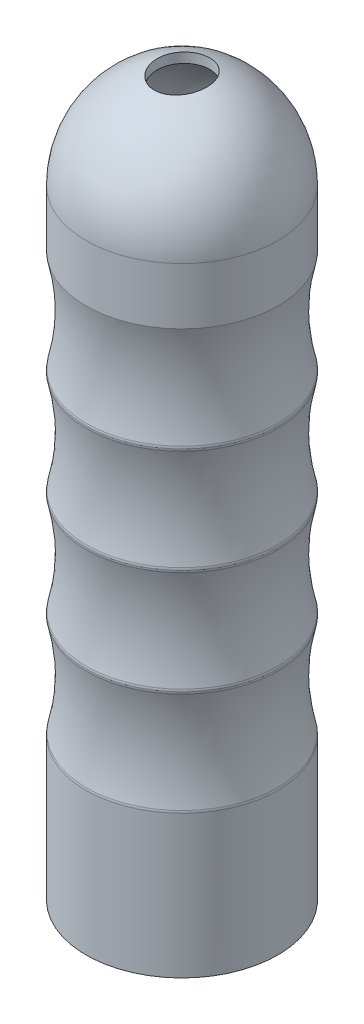
ISO-10303-21;
HEADER;
FILE_DESCRIPTION(('STEP AP214'),'2;1');
FILE_NAME('part.step','',(''),(''),'','','');
FILE_SCHEMA(('AUTOMOTIVE_DESIGN { 1 0 10303 214 1 1 1 1 }'));
ENDSEC;
DATA;
#1=APPLICATION_CONTEXT('core data for automotive mechanical design processes');
#2=APPLICATION_PROTOCOL_DEFINITION('international standard','automotive_design',2000,#1);
#3=PRODUCT_CONTEXT('',#1,'mechanical');
#4=PRODUCT('Part','Part','',(#3));
#5=PRODUCT_RELATED_PRODUCT_CATEGORY('part','',(#4));
#6=PRODUCT_DEFINITION_FORMATION('','',#4);
#7=PRODUCT_DEFINITION_CONTEXT('part definition',#1,'design');
#8=PRODUCT_DEFINITION('design','',#6,#7);
#9=PRODUCT_DEFINITION_SHAPE('','',#8);
#10=(LENGTH_UNIT() NAMED_UNIT(*) SI_UNIT(.MILLI.,.METRE.));
#11=(NAMED_UNIT(*) PLANE_ANGLE_UNIT() SI_UNIT($,.RADIAN.));
#12=(NAMED_UNIT(*) SI_UNIT($,.STERADIAN.) SOLID_ANGLE_UNIT());
#13=UNCERTAINTY_MEASURE_WITH_UNIT(LENGTH_MEASURE(1.E-05),#10,'distance_accuracy_value','');
#14=(GEOMETRIC_REPRESENTATION_CONTEXT(3) GLOBAL_UNCERTAINTY_ASSIGNED_CONTEXT((#13)) GLOBAL_UNIT_ASSIGNED_CONTEXT((#10,
#11,#12)) REPRESENTATION_CONTEXT('',''));
#15=CARTESIAN_POINT('',(0.,0.,0.));
#16=DIRECTION('',(0.,0.,1.));
#17=DIRECTION('',(1.,0.,0.));
#18=AXIS2_PLACEMENT_3D('',#15,#16,#17);
#19=CARTESIAN_POINT('',(0.,100.,0.));
#20=DIRECTION('',(0.,-1.,0.));
#21=DIRECTION('',(0.,0.,-1.));
#22=AXIS2_PLACEMENT_3D('',#19,#20,#21);
#23=DEGENERATE_TOROIDAL_SURFACE('',#22,1.03571428571432,16.5357142857143,.F.);
#24=CARTESIAN_POINT('',(0.,100.,0.));
#25=DIRECTION('',(0.,-1.,0.));
#26=DIRECTION('',(0.,0.,-1.));
#27=AXIS2_PLACEMENT_3D('',#24,#25,#26);
#28=CIRCLE('',#27,15.5);
#29=CARTESIAN_POINT('',(0.,100.,-15.5));
#30=VERTEX_POINT('',#29);
#31=EDGE_CURVE('E338',#30,#30,#28,.T.);
#32=ORIENTED_EDGE('',*,*,#31,.F.);
#33=EDGE_LOOP('',(#32));
#34=FACE_BOUND('',#33,.T.);
#35=CARTESIAN_POINT('',(0.,115.581582534701,-4.5));
#36=CARTESIAN_POINT('',(-0.0981692995057858,115.581582639021,-4.49999927074386));
#37=CARTESIAN_POINT('',(-0.196355590355747,115.581886487817,-4.49592922326536));
#38=CARTESIAN_POINT('',(-0.392087741586017,115.583094006383,-4.47969095949098));
#39=CARTESIAN_POINT('',(-0.489633277316327,115.583997959603,-4.46751891632919));
#40=CARTESIAN_POINT('',(-0.683575616075892,115.586384012318,-4.43517559616213));
#41=CARTESIAN_POINT('',(-0.779969931082185,115.587867189324,-4.41498940953482));
#42=CARTESIAN_POINT('',(-0.970799102324878,115.591371342624,-4.36684503018828));
#43=CARTESIAN_POINT('',(-1.06523323039939,115.593392515048,-4.33888400292785));
#44=CARTESIAN_POINT('',(-1.3489333838932,115.600291820635,-4.24229694021195));
#45=CARTESIAN_POINT('',(-1.53423719101143,115.60594914513,-4.16169921710396));
#46=CARTESIAN_POINT('',(-1.88943902964207,115.618721013184,-3.97248187186528));
#47=CARTESIAN_POINT('',(-2.05935684687812,115.625833645756,-3.86389894944936));
#48=CARTESIAN_POINT('',(-2.30463103741444,115.637286578682,-3.67980585583818));
#49=CARTESIAN_POINT('',(-2.38666530897151,115.64134485107,-3.61298131167068));
#50=CARTESIAN_POINT('',(-2.54532693574494,115.649581462553,-3.47321968521007));
#51=CARTESIAN_POINT('',(-2.62195481811878,115.653759789888,-3.40028320039162));
#52=CARTESIAN_POINT('',(-2.84472293385951,115.666412237084,-3.17165758359934));
#53=CARTESIAN_POINT('',(-2.98215920977308,115.674926635766,-3.00735482070537));
#54=CARTESIAN_POINT('',(-3.23204871844149,115.691314233588,-2.66063811629832));
#55=CARTESIAN_POINT('',(-3.34448219807091,115.699186922666,-2.4782100185554));
#56=CARTESIAN_POINT('',(-3.50103625229872,115.710589505233,-2.18012199440756));
#57=CARTESIAN_POINT('',(-3.5539013881414,115.714544796162,-2.06897219072291));
#58=CARTESIAN_POINT('',(-3.65084685065127,115.721937628216,-1.8429882945287));
#59=CARTESIAN_POINT('',(-3.69493482135134,115.725375619214,-1.72815750988909));
#60=CARTESIAN_POINT('',(-3.77428461627472,115.731654482448,-1.49546535595576));
#61=CARTESIAN_POINT('',(-3.80954589659672,115.734495317885,-1.37760380039893));
#62=CARTESIAN_POINT('',(-3.87118723358227,115.739515395965,-1.13956668947431));
#63=CARTESIAN_POINT('',(-3.89756535641247,115.74169449454,-1.01939063626022));
#64=CARTESIAN_POINT('',(-3.96327390416609,115.747156747373,-0.65650861115802));
#65=CARTESIAN_POINT('',(-3.9892525801111,115.749370914344,-0.411229662861117));
#66=CARTESIAN_POINT('',(-4.0053403483565,115.750736932278,0.0803880214183862));
#67=CARTESIAN_POINT('',(-3.99545064655767,115.749888886196,0.326726721493843));
#68=CARTESIAN_POINT('',(-3.93987325575734,115.745208236019,0.815375229785288));
#69=CARTESIAN_POINT('',(-3.89418368521851,115.741375475058,1.05768482555966));
#70=CARTESIAN_POINT('',(-3.76726472288431,115.731066834872,1.5327991795074));
#71=CARTESIAN_POINT('',(-3.68603028276513,115.724590580211,1.76560258240983));
#72=CARTESIAN_POINT('',(-3.48848375854376,115.7095911775,2.2160628331973));
#73=CARTESIAN_POINT('',(-3.37216329182448,115.701067540398,2.43371604614638));
#74=CARTESIAN_POINT('',(-3.17308828333652,115.687448375878,2.742833224739));
#75=CARTESIAN_POINT('',(-3.10295371002364,115.682789600346,2.84262038126001));
#76=CARTESIAN_POINT('',(-2.95465109458715,115.673311752821,3.03602123947158));
#77=CARTESIAN_POINT('',(-2.8764858269858,115.668492736576,3.12963705506889));
#78=CARTESIAN_POINT('',(-2.71722896589628,115.659112415068,3.30457607872355));
#79=CARTESIAN_POINT('',(-2.63657453552406,115.654552486888,3.38629785639377));
#80=CARTESIAN_POINT('',(-2.46866358717294,115.645526763144,3.54287512043677));
#81=CARTESIAN_POINT('',(-2.38139973247379,115.641061079436,3.61772276622952));
#82=CARTESIAN_POINT('',(-2.20437809975596,115.632528245951,3.75687841101569));
#83=CARTESIAN_POINT('',(-2.11485713785364,115.628452311434,3.82148699979542));
#84=CARTESIAN_POINT('',(-1.93068265831056,115.620620516647,3.94293730718286));
#85=CARTESIAN_POINT('',(-1.83602964063029,115.616864625289,3.99977978046667));
#86=CARTESIAN_POINT('',(-1.64217495800874,115.609782092918,4.10506976553516));
#87=CARTESIAN_POINT('',(-1.54297451658104,115.606455337351,4.15351951886356));
#88=CARTESIAN_POINT('',(-1.34071301479137,115.600332413337,4.24144925372566));
#89=CARTESIAN_POINT('',(-1.23765401555118,115.597535966325,4.28093394667962));
#90=CARTESIAN_POINT('',(-1.03212402133939,115.592648888613,4.34922569284019));
#91=CARTESIAN_POINT('',(-0.929763539630643,115.590536612557,4.37836379749168));
#92=CARTESIAN_POINT('',(-0.7229699950416,115.586951891375,4.42748140470956));
#93=CARTESIAN_POINT('',(-0.61853935359076,115.58547874009,4.44747101664569));
#94=CARTESIAN_POINT('',(-0.41606571162259,115.583298306269,4.47695290113798));
#95=CARTESIAN_POINT('',(-0.318119630406357,115.58254255329,4.48711063026521));
#96=CARTESIAN_POINT('',(-0.121618389467321,115.581636316339,4.49928278998818));
#97=CARTESIAN_POINT('',(-0.0230627157088372,115.581486442663,4.5012890096696));
#98=CARTESIAN_POINT('',(0.175194482304086,115.581799956238,4.49708364806648));
#99=CARTESIAN_POINT('',(0.274893655773924,115.582271591614,4.49076154087941));
#100=CARTESIAN_POINT('',(0.473448145929714,115.583829608846,4.46977585629462));
#101=CARTESIAN_POINT('',(0.572303071371038,115.584916261524,4.45510860409503));
#102=CARTESIAN_POINT('',(0.768437034805128,115.587674259279,4.41759857630489));
#103=CARTESIAN_POINT('',(0.865716105224745,115.589345592307,4.39475596916507));
#104=CARTESIAN_POINT('',(1.05805634189069,115.593227384229,4.3411497020133));
#105=CARTESIAN_POINT('',(1.15311739246463,115.595437871172,4.31038562989002));
#106=CARTESIAN_POINT('',(1.34026120345854,115.60033534057,4.24132118151143));
#107=CARTESIAN_POINT('',(1.43234887768276,115.603021483686,4.20303406755175));
#108=CARTESIAN_POINT('',(1.61306270168959,115.608799829481,4.11934064225222));
#109=CARTESIAN_POINT('',(1.70169263793331,115.611891570831,4.07394240794023));
#110=CARTESIAN_POINT('',(1.96187766840176,115.621669569992,3.9276135211775));
#111=CARTESIAN_POINT('',(2.12782118502556,115.628861160116,3.81651385677514));
#112=CARTESIAN_POINT('',(2.44286332386139,115.64400131013,3.56993562691236));
#113=CARTESIAN_POINT('',(2.59177955220546,115.651956639785,3.4342272988029));
#114=CARTESIAN_POINT('',(2.86894990945702,115.66790312895,3.14297662305691));
#115=CARTESIAN_POINT('',(2.99719182147148,115.675894306798,2.9874226447437));
#116=CARTESIAN_POINT('',(3.18262955751401,115.688084900251,2.72861874675043));
#117=CARTESIAN_POINT('',(3.24718146951888,115.692478282742,2.63054297613498));
#118=CARTESIAN_POINT('',(3.36849358548229,115.700957988716,2.42981201657817));
#119=CARTESIAN_POINT('',(3.42526139972215,115.705044610316,2.32716143232311));
#120=CARTESIAN_POINT('',(3.58375217133794,115.716703236725,2.01322726020517));
#121=CARTESIAN_POINT('',(3.6737333203222,115.723678846788,1.7958613920997));
#122=CARTESIAN_POINT('',(3.82219882892735,115.735468908553,1.34830874892099));
#123=CARTESIAN_POINT('',(3.88035656166295,115.740260867248,1.11801482573326));
#124=CARTESIAN_POINT('',(3.96352200157854,115.747180756579,0.651338400924673));
#125=CARTESIAN_POINT('',(3.9885202276262,115.749307925275,0.414954177621061));
#126=CARTESIAN_POINT('',(4.00172093609785,115.750430107941,0.0403149811168532));
#127=CARTESIAN_POINT('',(4.00093756465416,115.750362807181,-0.0976477872137998));
#128=CARTESIAN_POINT('',(3.98811774160789,115.749275246901,-0.372967207473886));
#129=CARTESIAN_POINT('',(3.97608973651351,115.748255702668,-0.510324236608462));
#130=CARTESIAN_POINT('',(3.94085042150531,115.745295041372,-0.783209868959912));
#131=CARTESIAN_POINT('',(3.91766969175127,115.743356444514,-0.918742436243757));
#132=CARTESIAN_POINT('',(3.86019117098585,115.738615260566,-1.18740671841837));
#133=CARTESIAN_POINT('',(3.82589154521083,115.735812530888,-1.32053803324095));
#134=CARTESIAN_POINT('',(3.70909873415271,115.726437168015,-1.70591629216871));
#135=CARTESIAN_POINT('',(3.61145743982515,115.718783174658,-1.95374482972922));
#136=CARTESIAN_POINT('',(3.38127065113269,115.701774015461,-2.41813433500755));
#137=CARTESIAN_POINT('',(3.25059425190284,115.692516421403,-2.63561973678282));
#138=CARTESIAN_POINT('',(3.0325443734886,115.678237778062,-2.93709275470413));
#139=CARTESIAN_POINT('',(2.95864190828179,115.673555115144,-3.03103268696996));
#140=CARTESIAN_POINT('',(2.80331634934688,115.664119459507,-3.21244741381955));
#141=CARTESIAN_POINT('',(2.72189658993059,115.659366498746,-3.29992504407124));
#142=CARTESIAN_POINT('',(2.55664272431151,115.650187615707,-3.4629123256547));
#143=CARTESIAN_POINT('',(2.47319870237599,115.645758276526,-3.53881776882781));
#144=CARTESIAN_POINT('',(2.30031900933436,115.637074548836,-3.6834306491156));
#145=CARTESIAN_POINT('',(2.21088556242406,115.632820096319,-3.75214073421908));
#146=CARTESIAN_POINT('',(2.03127877629518,115.624818243305,-3.87831834043202));
#147=CARTESIAN_POINT('',(1.94138649062523,115.621055975339,-3.93618498866321));
#148=CARTESIAN_POINT('',(1.75698797558048,115.613890442016,-4.04434222193112));
#149=CARTESIAN_POINT('',(1.66247643049366,115.610487605223,-4.0946237929045));
#150=CARTESIAN_POINT('',(1.47218360200121,115.604229387557,-4.18570597310132));
#151=CARTESIAN_POINT('',(1.3765100410159,115.601361451304,-4.22673065827977));
#152=CARTESIAN_POINT('',(1.18203654786861,115.596139373942,-4.30057931796065));
#153=CARTESIAN_POINT('',(1.08323684989915,115.593785194451,-4.33340390513702));
#154=CARTESIAN_POINT('',(0.883256554560465,115.589659570098,-4.39045454389202));
#155=CARTESIAN_POINT('',(0.782077879293093,115.58788767102,-4.41468729884609));
#156=CARTESIAN_POINT('',(0.578040645139686,115.584977316343,-4.45428625921889));
#157=CARTESIAN_POINT('',(0.475183152983456,115.583838473479,-4.46965788554037));
#158=CARTESIAN_POINT('',(0.310107768491811,115.582550835813,-4.4869993980547));
#159=CARTESIAN_POINT('',(0.24818276023607,115.582188069459,-4.49187286080678));
#160=CARTESIAN_POINT('',(0.124174076403584,115.581703911178,-4.49837305256279));
#161=CARTESIAN_POINT('',(0.0620904367684074,115.581582468721,-4.50000046124228));
#162=CARTESIAN_POINT('',(0.,115.581582534701,-4.5));
#163=B_SPLINE_CURVE_WITH_KNOTS('',3,(#35,#36,#37,#38,#39,#40,#41,#42,#43,#44,#45,#46,#47,#48,
#49,#50,#51,#52,#53,#54,#55,#56,#57,#58,#59,#60,#61,#62,#63,#64,#65,#66,#67,#68,#69,#70,#71,#72,
#73,#74,#75,#76,#77,#78,#79,#80,#81,#82,#83,#84,#85,#86,#87,#88,#89,#90,#91,#92,#93,#94,#95,#96,
#97,#98,#99,#100,#101,#102,#103,#104,#105,#106,#107,#108,#109,#110,#111,#112,#113,#114,#115,
#116,#117,#118,#119,#120,#121,#122,#123,#124,#125,#126,#127,#128,#129,#130,#131,#132,#133,#134,
#135,#136,#137,#138,#139,#140,#141,#142,#143,#144,#145,#146,#147,#148,#149,#150,#151,#152,#153,
#154,#155,#156,#157,#158,#159,#160,#161,#162),.UNSPECIFIED.,.T.,.F.,(4,2,2,2,2,2,2,2,2,2,2,2,2,
2,2,2,2,2,2,2,2,2,2,2,2,2,2,2,2,2,2,2,2,2,2,2,2,2,2,2,2,2,2,2,2,2,2,2,2,2,2,2,2,2,2,2,2,2,2,2,2,
2,2,4),(0.,0.294452293259588,0.589043765785834,0.884185888031771,1.17943575420838,
1.78304057243121,2.38585781728426,2.70323211614143,3.02057542608706,3.66118034665213,
4.30228958463133,4.67139628717186,5.04018011477927,5.40898666128245,5.77787344390094,
6.51495969349684,7.25202116236082,7.98912137163735,8.72632630288989,9.46370750397552,
9.82953728145861,10.1952410908481,10.5395975563153,10.8843420369144,11.2153902247125,
11.5464062198238,11.8773336697808,12.2080868023635,12.5270243637852,12.8456086332076,
13.1406972055452,13.436082943362,13.7354285332211,14.0349060426638,14.334377381818,
14.6338643040088,14.9328279253764,15.2314544046814,15.8284120524039,16.4312607540559,
17.0344643962956,17.3866329833453,17.7384547726121,18.4417345099428,19.1521032349873,
19.8626750284681,20.2761690115077,20.6893526441543,21.1014097512634,21.5135348878401,
22.309098825283,23.0670384536611,23.425551706468,23.7839066969842,24.1222078411131,
24.4603840450714,24.7809498062098,25.1018935745585,25.4139455773219,25.7259742580042,
26.0377589543951,26.3493527097487,26.5356278580086,26.7218639989202),.UNSPECIFIED.);
#164=CARTESIAN_POINT('',(0.,115.581582534701,-4.5));
#165=VERTEX_POINT('',#164);
#166=EDGE_CURVE('E95',#165,#165,#163,.T.);
#167=ORIENTED_EDGE('',*,*,#166,.F.);
#168=EDGE_LOOP('',(#167));
#169=FACE_BOUND('',#168,.T.);
#170=ADVANCED_FACE('F34',(#34,#169),#23,.F.);
#171=CARTESIAN_POINT('',(0.,100.,0.));
#172=DIRECTION('',(0.,-1.,0.));
#173=DIRECTION('',(0.,0.,-1.));
#174=AXIS2_PLACEMENT_3D('',#171,#172,#173);
#175=DEGENERATE_TOROIDAL_SURFACE('',#174,1.03571428571432,15.0357142857143,.F.);
#176=CARTESIAN_POINT('',(0.,100.,0.));
#177=DIRECTION('',(0.,-1.,0.));
#178=DIRECTION('',(0.,0.,-1.));
#179=AXIS2_PLACEMENT_3D('',#176,#177,#178);
#180=CIRCLE('',#179,14.);
#181=CARTESIAN_POINT('',(0.,100.,-14.));
#182=VERTEX_POINT('',#181);
#183=EDGE_CURVE('E343',#182,#182,#180,.T.);
#184=ORIENTED_EDGE('',*,*,#183,.T.);
#185=EDGE_LOOP('',(#184));
#186=FACE_BOUND('',#185,.T.);
#187=CARTESIAN_POINT('',(0.,113.979576940257,-4.49999999999997));
#188=CARTESIAN_POINT('',(0.0976351991939196,113.979576163048,-4.50000464423259));
#189=CARTESIAN_POINT('',(0.195233332629258,113.979911592816,-4.49597740803208));
#190=CARTESIAN_POINT('',(0.389764654123515,113.981242113155,-4.47992780931387));
#191=CARTESIAN_POINT('',(0.486697959612835,113.98223708403,-4.4679068975097));
#192=CARTESIAN_POINT('',(0.680430220440437,113.984877324166,-4.4357992043573));
#193=CARTESIAN_POINT('',(0.777212995988072,113.986530407267,-4.41561545733166));
#194=CARTESIAN_POINT('',(0.968807014329091,113.990440704286,-4.36741554080934));
#195=CARTESIAN_POINT('',(1.063617547833,113.992698131633,-4.33939660408304));
#196=CARTESIAN_POINT('',(1.34445434623753,114.000300530204,-4.24389586843468));
#197=CARTESIAN_POINT('',(1.52670540832675,114.006472998396,-4.16500057038771));
#198=CARTESIAN_POINT('',(1.88384729394208,114.02069273982,-3.97616058616751));
#199=CARTESIAN_POINT('',(2.05811738305479,114.028807271845,-3.86506170064872));
#200=CARTESIAN_POINT('',(2.38727751494388,114.045946823452,-3.61753854331314));
#201=CARTESIAN_POINT('',(2.54218912262715,114.054970809301,-3.48114288015398));
#202=CARTESIAN_POINT('',(2.7638361539744,114.068935380439,-3.25516264299606));
#203=CARTESIAN_POINT('',(2.83829955943122,114.073840683537,-3.17298404405439));
#204=CARTESIAN_POINT('',(2.98070868026211,114.083566648995,-3.00316791285982));
#205=CARTESIAN_POINT('',(3.04865490679278,114.088387317968,-2.91553080962006));
#206=CARTESIAN_POINT('',(3.24364731033528,114.102646892404,-2.64359578050081));
#207=CARTESIAN_POINT('',(3.36039127520336,114.111787999755,-2.4517708836334));
#208=CARTESIAN_POINT('',(3.56523070742686,114.128475855185,-2.05325508973514));
#209=CARTESIAN_POINT('',(3.65330512941245,114.136021430618,-1.84655340744513));
#210=CARTESIAN_POINT('',(3.76895690027668,114.146178185625,-1.5129116297235));
#211=CARTESIAN_POINT('',(3.80635281602666,114.14952518791,-1.38930268874936));
#212=CARTESIAN_POINT('',(3.87133201927111,114.155406473304,-1.13961012960045));
#213=CARTESIAN_POINT('',(3.89892375111167,114.157941455619,-1.01352874020745));
#214=CARTESIAN_POINT('',(3.9442852391106,114.1621379904,-0.759577166328964));
#215=CARTESIAN_POINT('',(3.96205346049826,114.163799406383,-0.631706705526789));
#216=CARTESIAN_POINT('',(3.98774425184293,114.166209888955,-0.374974284869603));
#217=CARTESIAN_POINT('',(3.99566471015139,114.166958759867,-0.246112118322276));
#218=CARTESIAN_POINT('',(4.0046031912034,114.167799315009,0.140761227155291));
#219=CARTESIAN_POINT('',(3.99083845351762,114.166488744287,0.399285876743659));
#220=CARTESIAN_POINT('',(3.9239205513343,114.160241145117,0.911032443995296));
#221=CARTESIAN_POINT('',(3.87076460520842,114.155303860567,1.16425398587863));
#222=CARTESIAN_POINT('',(3.72530421060488,114.142280625878,1.65941500129486));
#223=CARTESIAN_POINT('',(3.63299275119772,114.13419411188,1.90135244575609));
#224=CARTESIAN_POINT('',(3.46677726307347,114.120419973438,2.24856377817294));
#225=CARTESIAN_POINT('',(3.40726167351655,114.115594159,2.36094723705607));
#226=CARTESIAN_POINT('',(3.27912944551143,114.105520839233,2.58037419424578));
#227=CARTESIAN_POINT('',(3.21051606772451,114.100273485248,2.68741958689699));
#228=CARTESIAN_POINT('',(3.06849174238989,114.08980505958,2.88946121659844));
#229=CARTESIAN_POINT('',(2.99556128654106,114.08459882155,2.98479648819088));
#230=CARTESIAN_POINT('',(2.84195512880453,114.074074544309,3.16921080745128));
#231=CARTESIAN_POINT('',(2.76127040499274,114.06875638063,3.25828235365227));
#232=CARTESIAN_POINT('',(2.5961538755494,114.058389351048,3.4255838074553));
#233=CARTESIAN_POINT('',(2.51202575697155,114.053338623569,3.50411319637616));
#234=CARTESIAN_POINT('',(2.33744691577435,114.043417268995,3.65380614880876));
#235=CARTESIAN_POINT('',(2.24699686467839,114.038546622856,3.72497049265852));
#236=CARTESIAN_POINT('',(2.06028702988195,114.029128353197,3.85917388657513));
#237=CARTESIAN_POINT('',(1.96402955420831,114.024580602895,3.92221613375362));
#238=CARTESIAN_POINT('',(1.76631262186168,114.015948014821,4.03945800678426));
#239=CARTESIAN_POINT('',(1.66485604806189,114.011862924455,4.09366246488482));
#240=CARTESIAN_POINT('',(1.46146608371462,114.004433615933,4.19065675563516));
#241=CARTESIAN_POINT('',(1.35970719878199,114.001066637282,4.23381067420654));
#242=CARTESIAN_POINT('',(1.15279943692106,113.994987445286,4.31080764674879));
#243=CARTESIAN_POINT('',(1.04765367663551,113.992274648425,4.34465900218972));
#244=CARTESIAN_POINT('',(0.845430766875002,113.987824197914,4.39973611107274));
#245=CARTESIAN_POINT('',(0.748606984134707,113.986015868006,4.42188983653005));
#246=CARTESIAN_POINT('',(0.553433463594797,113.983045449655,4.45810870694141));
#247=CARTESIAN_POINT('',(0.455083581166409,113.98188342285,4.47217308039827));
#248=CARTESIAN_POINT('',(0.258536351333467,113.980246369352,4.49194859370472));
#249=CARTESIAN_POINT('',(0.160347323177148,113.979764585345,4.4977419021931));
#250=CARTESIAN_POINT('',(-0.0361738869038886,113.979479397111,4.5011738810901));
#251=CARTESIAN_POINT('',(-0.13450606763982,113.979675987282,4.49881261883513));
#252=CARTESIAN_POINT('',(-0.330634910861735,113.98074219249,4.48596196226105));
#253=CARTESIAN_POINT('',(-0.428431566433407,113.981611816197,4.47547246324408));
#254=CARTESIAN_POINT('',(-0.622809671749595,113.98400015961,4.44648626278204));
#255=CARTESIAN_POINT('',(-0.719391241495384,113.985518814691,4.42799035853593));
#256=CARTESIAN_POINT('',(-0.910683111401306,113.989164229315,4.3831987871292));
#257=CARTESIAN_POINT('',(-1.00539407349856,113.991290769473,4.35690593373669));
#258=CARTESIAN_POINT('',(-1.19240481724487,113.996096108318,4.29679999577828));
#259=CARTESIAN_POINT('',(-1.28470349464864,113.998775155099,4.26298353232718));
#260=CARTESIAN_POINT('',(-1.55904492005188,114.007604687242,4.14993698415457));
#261=CARTESIAN_POINT('',(-1.73660463734991,114.014508872206,4.05956632409844));
#262=CARTESIAN_POINT('',(-2.07592692790213,114.029648001123,3.85267980264971));
#263=CARTESIAN_POINT('',(-2.23766053884939,114.037885314271,3.73611724785978));
#264=CARTESIAN_POINT('',(-2.55680378301979,114.055761026234,3.46857741559106));
#265=CARTESIAN_POINT('',(-2.71235236909875,114.065458229769,3.31538601051278));
#266=CARTESIAN_POINT('',(-2.99835342745956,114.084622197127,2.98740972919399));
#267=CARTESIAN_POINT('',(-3.12882651988958,114.094089144649,2.81264279094));
#268=CARTESIAN_POINT('',(-3.3102528150074,114.107931706264,2.52920548017149));
#269=CARTESIAN_POINT('',(-3.37049390230417,114.112674564273,2.42636248778911));
#270=CARTESIAN_POINT('',(-3.48286973834733,114.121733355561,2.21641407897016));
#271=CARTESIAN_POINT('',(-3.53500989134452,114.126049572753,2.10931156454926));
#272=CARTESIAN_POINT('',(-3.67912429341428,114.138204761946,1.78258513430417));
#273=CARTESIAN_POINT('',(-3.7588764536721,114.145256928747,1.55740988835009));
#274=CARTESIAN_POINT('',(-3.88498394471315,114.156620059313,1.09801867208372));
#275=CARTESIAN_POINT('',(-3.93134458894082,114.16093145919,0.863804146404147));
#276=CARTESIAN_POINT('',(-3.99050022124912,114.166460417446,0.391150778965715));
#277=CARTESIAN_POINT('',(-4.00329785902562,114.167678220054,0.152712272173478));
#278=CARTESIAN_POINT('',(-3.99526012313022,114.166919503423,-0.323587166505279));
#279=CARTESIAN_POINT('',(-3.97442486690789,114.164942995338,-0.561448100405839));
#280=CARTESIAN_POINT('',(-3.8992207259332,114.157957900516,-1.03180972207236));
#281=CARTESIAN_POINT('',(-3.84484943552675,114.152949096261,-1.26431002406063));
#282=CARTESIAN_POINT('',(-3.70286779916998,114.140320629388,-1.7189482832106));
#283=CARTESIAN_POINT('',(-3.61525242355111,114.132700571716,-1.94108466664812));
#284=CARTESIAN_POINT('',(-3.40740914849956,114.115525859975,-2.36962180714392));
#285=CARTESIAN_POINT('',(-3.2871734818436,114.105970745286,-2.57601880147952));
#286=CARTESIAN_POINT('',(-3.01535401889662,114.0858459631,-2.96717792440934));
#287=CARTESIAN_POINT('',(-2.86375985434125,114.075275960666,-3.15193286562474));
#288=CARTESIAN_POINT('',(-2.53918605493774,114.054741730677,-3.4854046473227));
#289=CARTESIAN_POINT('',(-2.36753922645508,114.044772303039,-3.63540338098393));
#290=CARTESIAN_POINT('',(-2.09781524294311,114.030969219204,-3.83325179917363));
#291=CARTESIAN_POINT('',(-2.00853930390519,114.026666786446,-3.89332651363007));
#292=CARTESIAN_POINT('',(-1.82529968445018,114.018443659261,-4.00587831999196));
#293=CARTESIAN_POINT('',(-1.73133722746512,114.014522865986,-4.05835738095542));
#294=CARTESIAN_POINT('',(-1.54349618697436,114.007334792244,-4.15302427419525));
#295=CARTESIAN_POINT('',(-1.44979518932555,114.004046371847,-4.19556288021234));
#296=CARTESIAN_POINT('',(-1.25911595200204,113.998004525258,-4.27276583285241));
#297=CARTESIAN_POINT('',(-1.16213522811181,113.995251515771,-4.30742404977209));
#298=CARTESIAN_POINT('',(-0.891956498497495,113.988532003865,-4.39126940537899));
#299=CARTESIAN_POINT('',(-0.716010372654242,113.985198183553,-4.431932060026));
#300=CARTESIAN_POINT('',(-0.35999996380376,113.980721723219,-4.48628870491608));
#301=CARTESIAN_POINT('',(-0.179937035460047,113.979578372617,-4.4999914408998));
#302=CARTESIAN_POINT('',(0.,113.979576940257,-4.49999999999997));
#303=B_SPLINE_CURVE_WITH_KNOTS('',3,(#187,#188,#189,#190,#191,#192,#193,#194,#195,#196,#197,
#198,#199,#200,#201,#202,#203,#204,#205,#206,#207,#208,#209,#210,#211,#212,#213,#214,#215,#216,
#217,#218,#219,#220,#221,#222,#223,#224,#225,#226,#227,#228,#229,#230,#231,#232,#233,#234,#235,
#236,#237,#238,#239,#240,#241,#242,#243,#244,#245,#246,#247,#248,#249,#250,#251,#252,#253,#254,
#255,#256,#257,#258,#259,#260,#261,#262,#263,#264,#265,#266,#267,#268,#269,#270,#271,#272,#273,
#274,#275,#276,#277,#278,#279,#280,#281,#282,#283,#284,#285,#286,#287,#288,#289,#290,#291,#292,
#293,#294,#295,#296,#297,#298,#299,#300,#301,#302),.UNSPECIFIED.,.T.,.F.,(4,2,2,2,2,2,2,2,2,2,2,
2,2,2,2,2,2,2,2,2,2,2,2,2,2,2,2,2,2,2,2,2,2,2,2,2,2,2,2,2,2,2,2,2,2,2,2,2,2,2,2,2,2,2,2,2,2,4),
(0.,0.292757545746834,0.585461975569948,0.881750628410536,1.17814405682724,1.7714733179237,
2.38946273331322,3.00675746664987,3.33948758185593,3.67219157893505,4.34380501723052,
5.01591035890256,5.40311295124511,5.78998123286886,6.1769099395758,6.56392160081731,
7.337261573391,8.11065616092749,8.88418928592298,9.26561891326139,9.64691220329236,
10.0069553610969,10.3674226130725,10.7126142583902,11.0577692925915,11.4027880451348,
11.7476175141114,12.0789332606623,12.4099523786631,12.707646805333,13.0053696189917,
13.3001136280892,13.5948552033425,13.8896005751547,14.1843166058744,14.4789264084447,
14.7736687895715,15.3690317651956,15.9654646610346,16.6183989421258,17.2707939813769,
17.6283246152553,17.9856157015507,18.6997318615099,19.4137343621993,20.1276804928962,
20.8416241304242,21.555618987521,22.2697219116716,22.9839950204544,23.6985046725708,
24.3795765031133,24.7023516877776,25.0250430474228,25.3335610458792,25.642318208051,
26.1820315726915,26.7215698265708),.UNSPECIFIED.);
#304=CARTESIAN_POINT('',(0.,113.979576940257,-4.49999999999997));
#305=VERTEX_POINT('',#304);
#306=EDGE_CURVE('E53',#305,#305,#303,.T.);
#307=ORIENTED_EDGE('',*,*,#306,.F.);
#308=EDGE_LOOP('',(#307));
#309=FACE_BOUND('',#308,.T.);
#310=ADVANCED_FACE('F77',(#186,#309),#175,.T.);
#311=CARTESIAN_POINT('',(0.,0.,0.));
#312=DIRECTION('',(0.,-1.,0.));
#313=DIRECTION('',(0.,0.,-1.));
#314=AXIS2_PLACEMENT_3D('',#311,#312,#313);
#315=CYLINDRICAL_SURFACE('',#314,14.);
#316=CARTESIAN_POINT('',(0.,23.0476341924392,0.));
#317=DIRECTION('',(0.,-1.,0.));
#318=DIRECTION('',(0.,0.,-1.));
#319=AXIS2_PLACEMENT_3D('',#316,#317,#318);
#320=CIRCLE('',#319,14.);
#321=CARTESIAN_POINT('',(0.,23.0476341924392,-14.));
#322=VERTEX_POINT('',#321);
#323=EDGE_CURVE('E102',#322,#322,#320,.T.);
#324=ORIENTED_EDGE('',*,*,#323,.F.);
#325=EDGE_LOOP('',(#324));
#326=FACE_BOUND('',#325,.T.);
#327=CARTESIAN_POINT('',(0.,0.,0.));
#328=DIRECTION('',(0.,-1.,0.));
#329=DIRECTION('',(0.,0.,-1.));
#330=AXIS2_PLACEMENT_3D('',#327,#328,#329);
#331=CIRCLE('',#330,14.);
#332=CARTESIAN_POINT('',(0.,0.,-14.));
#333=VERTEX_POINT('',#332);
#334=EDGE_CURVE('E120',#333,#333,#331,.T.);
#335=ORIENTED_EDGE('',*,*,#334,.T.);
#336=EDGE_LOOP('',(#335));
#337=FACE_BOUND('',#336,.T.);
#338=ADVANCED_FACE('F83',(#326,#337),#315,.F.);
#339=CARTESIAN_POINT('',(-15.5,0.,0.));
#340=DIRECTION('',(0.,1.,0.));
#341=DIRECTION('',(0.,0.,1.));
#342=AXIS2_PLACEMENT_3D('',#339,#340,#341);
#343=PLANE('',#342);
#344=ORIENTED_EDGE('',*,*,#334,.F.);
#345=EDGE_LOOP('',(#344));
#346=FACE_BOUND('',#345,.T.);
#347=CARTESIAN_POINT('',(0.,0.,0.));
#348=DIRECTION('',(0.,-1.,0.));
#349=DIRECTION('',(0.,0.,-1.));
#350=AXIS2_PLACEMENT_3D('',#347,#348,#349);
#351=CIRCLE('',#350,15.5);
#352=CARTESIAN_POINT('',(0.,0.,-15.5));
#353=VERTEX_POINT('',#352);
#354=EDGE_CURVE('E332',#353,#353,#351,.T.);
#355=ORIENTED_EDGE('',*,*,#354,.T.);
#356=EDGE_LOOP('',(#355));
#357=FACE_BOUND('',#356,.T.);
#358=ADVANCED_FACE('F238',(#346,#357),#343,.F.);
#359=CARTESIAN_POINT('',(0.,0.,0.));
#360=DIRECTION('',(0.,-1.,0.));
#361=DIRECTION('',(0.,0.,-1.));
#362=AXIS2_PLACEMENT_3D('',#359,#360,#361);
#363=CYLINDRICAL_SURFACE('',#362,15.5);
#364=CARTESIAN_POINT('',(0.,23.047634192439,0.));
#365=DIRECTION('',(0.,1.,0.));
#366=DIRECTION('',(0.,0.,1.));
#367=AXIS2_PLACEMENT_3D('',#364,#365,#366);
#368=CIRCLE('',#367,15.5);
#369=CARTESIAN_POINT('',(0.,23.047634192439,15.5));
#370=VERTEX_POINT('',#369);
#371=EDGE_CURVE('E10',#370,#370,#368,.F.);
#372=ORIENTED_EDGE('',*,*,#371,.T.);
#373=EDGE_LOOP('',(#372));
#374=FACE_BOUND('',#373,.T.);
#375=ORIENTED_EDGE('',*,*,#354,.F.);
#376=EDGE_LOOP('',(#375));
#377=FACE_BOUND('',#376,.T.);
#378=ADVANCED_FACE('F228',(#374,#377),#363,.T.);
#379=CARTESIAN_POINT('',(0.,31.5476341924392,0.));
#380=DIRECTION('',(0.,-1.,0.));
#381=DIRECTION('',(0.,0.,-1.));
#382=AXIS2_PLACEMENT_3D('',#379,#380,#381);
#383=TOROIDAL_SURFACE('',#382,48.9821382994236,34.5);
#384=CARTESIAN_POINT('',(0.,39.6934675257726,0.));
#385=DIRECTION('',(0.,-1.,0.));
#386=DIRECTION('',(0.,0.,-1.));
#387=AXIS2_PLACEMENT_3D('',#384,#385,#386);
#388=CIRCLE('',#387,15.4575890958093);
#389=CARTESIAN_POINT('',(0.,39.6934675257726,-15.4575890958093));
#390=VERTEX_POINT('',#389);
#391=EDGE_CURVE('E42',#390,#390,#388,.T.);
#392=ORIENTED_EDGE('',*,*,#391,.T.);
#393=EDGE_LOOP('',(#392));
#394=FACE_BOUND('',#393,.T.);
#395=CARTESIAN_POINT('',(0.,23.4018008591057,0.));
#396=DIRECTION('',(0.,1.,0.));
#397=DIRECTION('',(0.,0.,1.));
#398=AXIS2_PLACEMENT_3D('',#395,#396,#397);
#399=CIRCLE('',#398,15.4575890958093);
#400=CARTESIAN_POINT('',(0.,23.4018008591057,15.4575890958093));
#401=VERTEX_POINT('',#400);
#402=EDGE_CURVE('E47',#401,#401,#399,.T.);
#403=ORIENTED_EDGE('',*,*,#402,.T.);
#404=EDGE_LOOP('',(#403));
#405=FACE_BOUND('',#404,.T.);
#406=ADVANCED_FACE('F139',(#394,#405),#383,.F.);
#407=CARTESIAN_POINT('',(0.,48.5476341924392,0.));
#408=DIRECTION('',(0.,-1.,0.));
#409=DIRECTION('',(0.,0.,-1.));
#410=AXIS2_PLACEMENT_3D('',#407,#408,#409);
#411=TOROIDAL_SURFACE('',#410,48.9821382994236,34.5);
#412=CARTESIAN_POINT('',(0.,56.6934675257725,0.));
#413=DIRECTION('',(0.,-1.,0.));
#414=DIRECTION('',(0.,0.,-1.));
#415=AXIS2_PLACEMENT_3D('',#412,#413,#414);
#416=CIRCLE('',#415,15.4575890958093);
#417=CARTESIAN_POINT('',(0.,56.6934675257725,-15.4575890958093));
#418=VERTEX_POINT('',#417);
#419=EDGE_CURVE('E125',#418,#418,#416,.T.);
#420=ORIENTED_EDGE('',*,*,#419,.T.);
#421=EDGE_LOOP('',(#420));
#422=FACE_BOUND('',#421,.T.);
#423=CARTESIAN_POINT('',(0.,40.4018008591058,0.));
#424=DIRECTION('',(0.,1.,0.));
#425=DIRECTION('',(0.,0.,1.));
#426=AXIS2_PLACEMENT_3D('',#423,#424,#425);
#427=CIRCLE('',#426,15.4575890958093);
#428=CARTESIAN_POINT('',(0.,40.4018008591058,15.4575890958093));
#429=VERTEX_POINT('',#428);
#430=EDGE_CURVE('E122',#429,#429,#427,.T.);
#431=ORIENTED_EDGE('',*,*,#430,.T.);
#432=EDGE_LOOP('',(#431));
#433=FACE_BOUND('',#432,.T.);
#434=ADVANCED_FACE('F209',(#422,#433),#411,.F.);
#435=CARTESIAN_POINT('',(0.,65.5476341924392,0.));
#436=DIRECTION('',(0.,-1.,0.));
#437=DIRECTION('',(0.,0.,-1.));
#438=AXIS2_PLACEMENT_3D('',#435,#436,#437);
#439=TOROIDAL_SURFACE('',#438,48.9821382994236,34.5);
#440=CARTESIAN_POINT('',(0.,57.4018008591059,0.));
#441=DIRECTION('',(0.,1.,0.));
#442=DIRECTION('',(0.,0.,1.));
#443=AXIS2_PLACEMENT_3D('',#440,#441,#442);
#444=CIRCLE('',#443,15.4575890958093);
#445=CARTESIAN_POINT('',(0.,57.4018008591059,15.4575890958093));
#446=VERTEX_POINT('',#445);
#447=EDGE_CURVE('E131',#446,#446,#444,.T.);
#448=ORIENTED_EDGE('',*,*,#447,.T.);
#449=EDGE_LOOP('',(#448));
#450=FACE_BOUND('',#449,.T.);
#451=CARTESIAN_POINT('',(0.,73.6934675257725,0.));
#452=DIRECTION('',(0.,-1.,0.));
#453=DIRECTION('',(0.,0.,-1.));
#454=AXIS2_PLACEMENT_3D('',#451,#452,#453);
#455=CIRCLE('',#454,15.4575890958093);
#456=CARTESIAN_POINT('',(0.,73.6934675257725,-15.4575890958093));
#457=VERTEX_POINT('',#456);
#458=EDGE_CURVE('E128',#457,#457,#455,.T.);
#459=ORIENTED_EDGE('',*,*,#458,.T.);
#460=EDGE_LOOP('',(#459));
#461=FACE_BOUND('',#460,.T.);
#462=ADVANCED_FACE('F198',(#450,#461),#439,.F.);
#463=CARTESIAN_POINT('',(0.,82.5476341924392,0.));
#464=DIRECTION('',(0.,-1.,0.));
#465=DIRECTION('',(0.,0.,-1.));
#466=AXIS2_PLACEMENT_3D('',#463,#464,#465);
#467=TOROIDAL_SURFACE('',#466,48.9821382994236,34.5);
#468=CARTESIAN_POINT('',(0.,74.4018008591059,0.));
#469=DIRECTION('',(0.,1.,0.));
#470=DIRECTION('',(0.,0.,1.));
#471=AXIS2_PLACEMENT_3D('',#468,#469,#470);
#472=CIRCLE('',#471,15.4575890958093);
#473=CARTESIAN_POINT('',(0.,74.4018008591059,15.4575890958093));
#474=VERTEX_POINT('',#473);
#475=EDGE_CURVE('E134',#474,#474,#472,.T.);
#476=ORIENTED_EDGE('',*,*,#475,.T.);
#477=EDGE_LOOP('',(#476));
#478=FACE_BOUND('',#477,.T.);
#479=CARTESIAN_POINT('',(0.,90.8660724411894,0.));
#480=DIRECTION('',(0.,-1.,0.));
#481=DIRECTION('',(0.,0.,-1.));
#482=AXIS2_PLACEMENT_3D('',#479,#480,#481);
#483=CIRCLE('',#482,15.5);
#484=CARTESIAN_POINT('',(0.,90.8660724411894,-15.5));
#485=VERTEX_POINT('',#484);
#486=EDGE_CURVE('E334',#485,#485,#483,.T.);
#487=ORIENTED_EDGE('',*,*,#486,.T.);
#488=EDGE_LOOP('',(#487));
#489=FACE_BOUND('',#488,.T.);
#490=ADVANCED_FACE('F193',(#478,#489),#467,.F.);
#491=CARTESIAN_POINT('',(0.,0.,0.));
#492=DIRECTION('',(0.,-1.,0.));
#493=DIRECTION('',(0.,0.,-1.));
#494=AXIS2_PLACEMENT_3D('',#491,#492,#493);
#495=CYLINDRICAL_SURFACE('',#494,15.5);
#496=ORIENTED_EDGE('',*,*,#486,.F.);
#497=EDGE_LOOP('',(#496));
#498=FACE_BOUND('',#497,.T.);
#499=ORIENTED_EDGE('',*,*,#31,.T.);
#500=EDGE_LOOP('',(#499));
#501=FACE_BOUND('',#500,.T.);
#502=ADVANCED_FACE('F92',(#498,#501),#495,.T.);
#503=CARTESIAN_POINT('',(0.,0.,0.));
#504=DIRECTION('',(0.,-1.,0.));
#505=DIRECTION('',(0.,0.,-1.));
#506=AXIS2_PLACEMENT_3D('',#503,#504,#505);
#507=CYLINDRICAL_SURFACE('',#506,14.);
#508=ORIENTED_EDGE('',*,*,#183,.F.);
#509=EDGE_LOOP('',(#508));
#510=FACE_BOUND('',#509,.T.);
#511=CARTESIAN_POINT('',(0.,91.0476341924392,0.));
#512=DIRECTION('',(0.,-1.,0.));
#513=DIRECTION('',(0.,0.,-1.));
#514=AXIS2_PLACEMENT_3D('',#511,#512,#513);
#515=CIRCLE('',#514,14.);
#516=CARTESIAN_POINT('',(0.,91.0476341924392,-14.));
#517=VERTEX_POINT('',#516);
#518=EDGE_CURVE('E346',#517,#517,#515,.T.);
#519=ORIENTED_EDGE('',*,*,#518,.T.);
#520=EDGE_LOOP('',(#519));
#521=FACE_BOUND('',#520,.T.);
#522=ADVANCED_FACE('F293',(#510,#521),#507,.F.);
#523=CARTESIAN_POINT('',(0.,82.5476341924392,0.));
#524=DIRECTION('',(0.,-1.,0.));
#525=DIRECTION('',(0.,0.,-1.));
#526=AXIS2_PLACEMENT_3D('',#523,#524,#525);
#527=TOROIDAL_SURFACE('',#526,48.9821382994236,36.);
#528=ORIENTED_EDGE('',*,*,#518,.F.);
#529=EDGE_LOOP('',(#528));
#530=FACE_BOUND('',#529,.T.);
#531=CARTESIAN_POINT('',(0.,74.0476341924392,0.));
#532=DIRECTION('',(0.,-1.,0.));
#533=DIRECTION('',(0.,0.,-1.));
#534=AXIS2_PLACEMENT_3D('',#531,#532,#533);
#535=CIRCLE('',#534,14.);
#536=CARTESIAN_POINT('',(0.,74.0476341924392,-14.));
#537=VERTEX_POINT('',#536);
#538=EDGE_CURVE('E349',#537,#537,#535,.T.);
#539=ORIENTED_EDGE('',*,*,#538,.T.);
#540=EDGE_LOOP('',(#539));
#541=FACE_BOUND('',#540,.T.);
#542=ADVANCED_FACE('F283',(#530,#541),#527,.T.);
#543=CARTESIAN_POINT('',(0.,65.5476341924392,0.));
#544=DIRECTION('',(0.,-1.,0.));
#545=DIRECTION('',(0.,0.,-1.));
#546=AXIS2_PLACEMENT_3D('',#543,#544,#545);
#547=TOROIDAL_SURFACE('',#546,48.9821382994236,36.);
#548=ORIENTED_EDGE('',*,*,#538,.F.);
#549=EDGE_LOOP('',(#548));
#550=FACE_BOUND('',#549,.T.);
#551=CARTESIAN_POINT('',(0.,57.0476341924392,0.));
#552=DIRECTION('',(0.,-1.,0.));
#553=DIRECTION('',(0.,0.,-1.));
#554=AXIS2_PLACEMENT_3D('',#551,#552,#553);
#555=CIRCLE('',#554,14.);
#556=CARTESIAN_POINT('',(0.,57.0476341924392,-14.));
#557=VERTEX_POINT('',#556);
#558=EDGE_CURVE('E352',#557,#557,#555,.T.);
#559=ORIENTED_EDGE('',*,*,#558,.T.);
#560=EDGE_LOOP('',(#559));
#561=FACE_BOUND('',#560,.T.);
#562=ADVANCED_FACE('F274',(#550,#561),#547,.T.);
#563=CARTESIAN_POINT('',(0.,48.5476341924392,0.));
#564=DIRECTION('',(0.,-1.,0.));
#565=DIRECTION('',(0.,0.,-1.));
#566=AXIS2_PLACEMENT_3D('',#563,#564,#565);
#567=TOROIDAL_SURFACE('',#566,48.9821382994236,36.);
#568=ORIENTED_EDGE('',*,*,#558,.F.);
#569=EDGE_LOOP('',(#568));
#570=FACE_BOUND('',#569,.T.);
#571=CARTESIAN_POINT('',(0.,40.0476341924392,0.));
#572=DIRECTION('',(0.,-1.,0.));
#573=DIRECTION('',(0.,0.,-1.));
#574=AXIS2_PLACEMENT_3D('',#571,#572,#573);
#575=CIRCLE('',#574,14.);
#576=CARTESIAN_POINT('',(0.,40.0476341924392,-14.));
#577=VERTEX_POINT('',#576);
#578=EDGE_CURVE('E354',#577,#577,#575,.T.);
#579=ORIENTED_EDGE('',*,*,#578,.T.);
#580=EDGE_LOOP('',(#579));
#581=FACE_BOUND('',#580,.T.);
#582=ADVANCED_FACE('F265',(#570,#581),#567,.T.);
#583=CARTESIAN_POINT('',(0.,31.5476341924392,0.));
#584=DIRECTION('',(0.,-1.,0.));
#585=DIRECTION('',(0.,0.,-1.));
#586=AXIS2_PLACEMENT_3D('',#583,#584,#585);
#587=TOROIDAL_SURFACE('',#586,48.9821382994236,36.);
#588=ORIENTED_EDGE('',*,*,#578,.F.);
#589=EDGE_LOOP('',(#588));
#590=FACE_BOUND('',#589,.T.);
#591=ORIENTED_EDGE('',*,*,#323,.T.);
#592=EDGE_LOOP('',(#591));
#593=FACE_BOUND('',#592,.T.);
#594=ADVANCED_FACE('F110',(#590,#593),#587,.T.);
#595=CARTESIAN_POINT('',(0.,183.,0.));
#596=DIRECTION('',(0.,1.,0.));
#597=DIRECTION('',(0.,0.,1.));
#598=AXIS2_PLACEMENT_3D('',#595,#596,#597);
#599=ELLIPSE('',#598,4.5,4.);
#600=DIRECTION('',(0.,-1.,0.));
#601=VECTOR('',#600,1.);
#602=SURFACE_OF_LINEAR_EXTRUSION('',#599,#601);
#603=ORIENTED_EDGE('',*,*,#306,.T.);
#604=EDGE_LOOP('',(#603));
#605=FACE_BOUND('',#604,.T.);
#606=ORIENTED_EDGE('',*,*,#166,.T.);
#607=EDGE_LOOP('',(#606));
#608=FACE_BOUND('',#607,.T.);
#609=ADVANCED_FACE('F105',(#605,#608),#602,.T.);
#610=CARTESIAN_POINT('',(0.,57.0476341924392,0.));
#611=DIRECTION('',(0.,1.,0.));
#612=DIRECTION('',(0.,0.,1.));
#613=AXIS2_PLACEMENT_3D('',#610,#611,#612);
#614=TOROIDAL_SURFACE('',#613,14.,1.5);
#615=ORIENTED_EDGE('',*,*,#447,.F.);
#616=EDGE_LOOP('',(#615));
#617=FACE_BOUND('',#616,.T.);
#618=CARTESIAN_POINT('',(0.,57.0476341924392,0.));
#619=DIRECTION('',(0.,1.,0.));
#620=DIRECTION('',(0.,0.,1.));
#621=AXIS2_PLACEMENT_3D('',#618,#619,#620);
#622=CIRCLE('',#621,15.5);
#623=CARTESIAN_POINT('',(0.,57.0476341924392,15.5));
#624=VERTEX_POINT('',#623);
#625=EDGE_CURVE('E51',#624,#624,#622,.F.);
#626=ORIENTED_EDGE('',*,*,#625,.F.);
#627=EDGE_LOOP('',(#626));
#628=FACE_BOUND('',#627,.T.);
#629=ADVANCED_FACE('F109',(#617,#628),#614,.T.);
#630=CARTESIAN_POINT('',(0.,57.0476341924392,0.));
#631=DIRECTION('',(0.,1.,0.));
#632=DIRECTION('',(0.,0.,1.));
#633=AXIS2_PLACEMENT_3D('',#630,#631,#632);
#634=TOROIDAL_SURFACE('',#633,14.,1.5);
#635=ORIENTED_EDGE('',*,*,#625,.T.);
#636=EDGE_LOOP('',(#635));
#637=FACE_BOUND('',#636,.T.);
#638=ORIENTED_EDGE('',*,*,#419,.F.);
#639=EDGE_LOOP('',(#638));
#640=FACE_BOUND('',#639,.T.);
#641=ADVANCED_FACE('F168',(#637,#640),#634,.T.);
#642=CARTESIAN_POINT('',(0.,74.0476341924392,0.));
#643=DIRECTION('',(0.,1.,0.));
#644=DIRECTION('',(0.,0.,1.));
#645=AXIS2_PLACEMENT_3D('',#642,#643,#644);
#646=TOROIDAL_SURFACE('',#645,14.,1.5);
#647=ORIENTED_EDGE('',*,*,#475,.F.);
#648=EDGE_LOOP('',(#647));
#649=FACE_BOUND('',#648,.T.);
#650=CARTESIAN_POINT('',(0.,74.0476341924392,0.));
#651=DIRECTION('',(0.,1.,0.));
#652=DIRECTION('',(0.,0.,1.));
#653=AXIS2_PLACEMENT_3D('',#650,#651,#652);
#654=CIRCLE('',#653,15.5);
#655=CARTESIAN_POINT('',(0.,74.0476341924392,15.5));
#656=VERTEX_POINT('',#655);
#657=EDGE_CURVE('E54',#656,#656,#654,.F.);
#658=ORIENTED_EDGE('',*,*,#657,.F.);
#659=EDGE_LOOP('',(#658));
#660=FACE_BOUND('',#659,.T.);
#661=ADVANCED_FACE('F73',(#649,#660),#646,.T.);
#662=CARTESIAN_POINT('',(0.,74.0476341924392,0.));
#663=DIRECTION('',(0.,1.,0.));
#664=DIRECTION('',(0.,0.,1.));
#665=AXIS2_PLACEMENT_3D('',#662,#663,#664);
#666=TOROIDAL_SURFACE('',#665,14.,1.5);
#667=ORIENTED_EDGE('',*,*,#657,.T.);
#668=EDGE_LOOP('',(#667));
#669=FACE_BOUND('',#668,.T.);
#670=ORIENTED_EDGE('',*,*,#458,.F.);
#671=EDGE_LOOP('',(#670));
#672=FACE_BOUND('',#671,.T.);
#673=ADVANCED_FACE('F65',(#669,#672),#666,.T.);
#674=CARTESIAN_POINT('',(0.,40.0476341924393,0.));
#675=DIRECTION('',(0.,1.,0.));
#676=DIRECTION('',(0.,0.,1.));
#677=AXIS2_PLACEMENT_3D('',#674,#675,#676);
#678=TOROIDAL_SURFACE('',#677,14.,1.5);
#679=ORIENTED_EDGE('',*,*,#391,.F.);
#680=EDGE_LOOP('',(#679));
#681=FACE_BOUND('',#680,.T.);
#682=CARTESIAN_POINT('',(0.,40.0476341924393,0.));
#683=DIRECTION('',(0.,1.,0.));
#684=DIRECTION('',(0.,0.,1.));
#685=AXIS2_PLACEMENT_3D('',#682,#683,#684);
#686=CIRCLE('',#685,15.5);
#687=CARTESIAN_POINT('',(0.,40.0476341924393,15.5));
#688=VERTEX_POINT('',#687);
#689=EDGE_CURVE('E38',#688,#688,#686,.T.);
#690=ORIENTED_EDGE('',*,*,#689,.F.);
#691=EDGE_LOOP('',(#690));
#692=FACE_BOUND('',#691,.T.);
#693=ADVANCED_FACE('F63',(#681,#692),#678,.T.);
#694=CARTESIAN_POINT('',(0.,40.0476341924391,0.));
#695=DIRECTION('',(0.,1.,0.));
#696=DIRECTION('',(0.,0.,1.));
#697=AXIS2_PLACEMENT_3D('',#694,#695,#696);
#698=TOROIDAL_SURFACE('',#697,14.,1.5);
#699=ORIENTED_EDGE('',*,*,#430,.F.);
#700=EDGE_LOOP('',(#699));
#701=FACE_BOUND('',#700,.T.);
#702=ORIENTED_EDGE('',*,*,#689,.T.);
#703=EDGE_LOOP('',(#702));
#704=FACE_BOUND('',#703,.T.);
#705=ADVANCED_FACE('F61',(#701,#704),#698,.T.);
#706=CARTESIAN_POINT('',(0.,23.047634192439,0.));
#707=DIRECTION('',(0.,1.,0.));
#708=DIRECTION('',(0.,0.,1.));
#709=AXIS2_PLACEMENT_3D('',#706,#707,#708);
#710=TOROIDAL_SURFACE('',#709,14.,1.5);
#711=ORIENTED_EDGE('',*,*,#402,.F.);
#712=EDGE_LOOP('',(#711));
#713=FACE_BOUND('',#712,.T.);
#714=ORIENTED_EDGE('',*,*,#371,.F.);
#715=EDGE_LOOP('',(#714));
#716=FACE_BOUND('',#715,.T.);
#717=ADVANCED_FACE('F36',(#713,#716),#710,.T.);
#718=CLOSED_SHELL('',(#170,#310,#338,#358,#378,#406,#434,#462,#490,#502,#522,#542,#562,#582,
#594,#609,#629,#641,#661,#673,#693,#705,#717));
#719=MANIFOLD_SOLID_BREP('B2',#718);
#720=ADVANCED_BREP_SHAPE_REPRESENTATION('',(#18,#719),#14);
#721=SHAPE_DEFINITION_REPRESENTATION(#9,#720);
ENDSEC;
END-ISO-10303-21;
